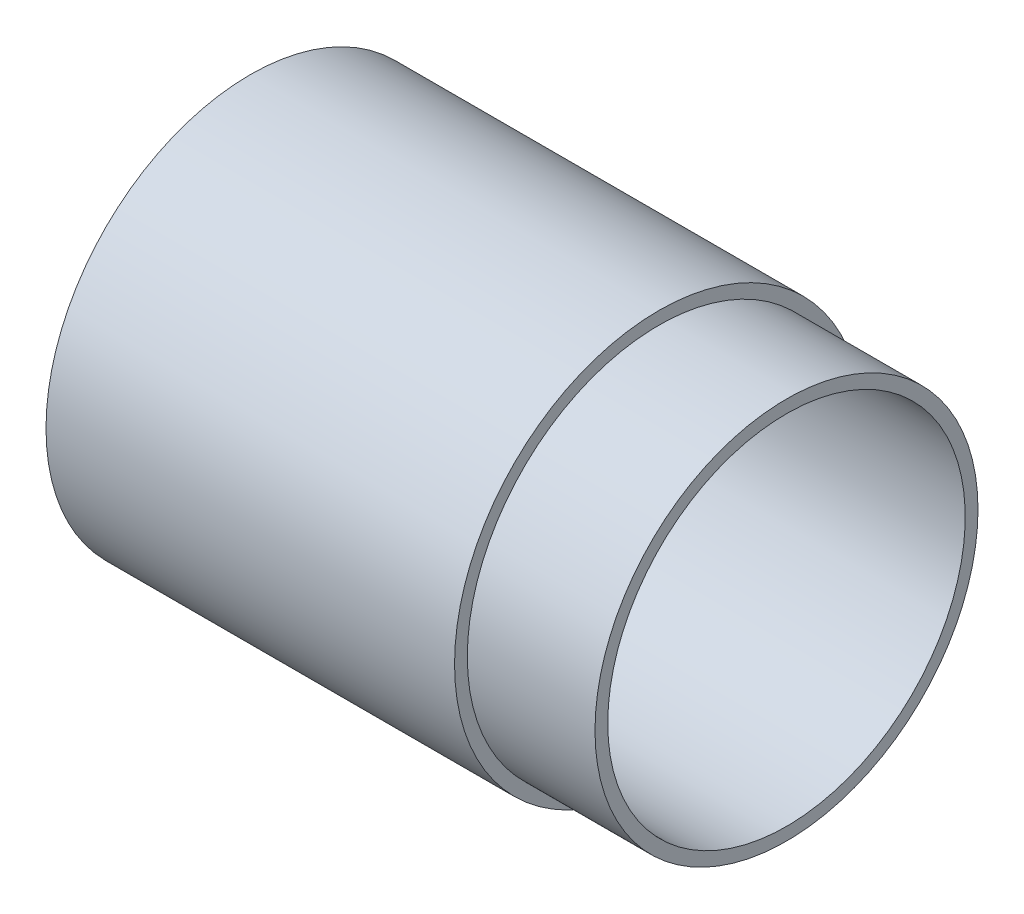
ISO-10303-21;
HEADER;
FILE_DESCRIPTION(('STEP AP214'),'2;1');
FILE_NAME('part.step','',(''),(''),'','','');
FILE_SCHEMA(('AUTOMOTIVE_DESIGN { 1 0 10303 214 1 1 1 1 }'));
ENDSEC;
DATA;
#1=APPLICATION_CONTEXT('core data for automotive mechanical design processes');
#2=APPLICATION_PROTOCOL_DEFINITION('international standard','automotive_design',2000,#1);
#3=PRODUCT_CONTEXT('',#1,'mechanical');
#4=PRODUCT('Part','Part','',(#3));
#5=PRODUCT_RELATED_PRODUCT_CATEGORY('part','',(#4));
#6=PRODUCT_DEFINITION_FORMATION('','',#4);
#7=PRODUCT_DEFINITION_CONTEXT('part definition',#1,'design');
#8=PRODUCT_DEFINITION('design','',#6,#7);
#9=PRODUCT_DEFINITION_SHAPE('','',#8);
#10=(LENGTH_UNIT() NAMED_UNIT(*) SI_UNIT(.MILLI.,.METRE.));
#11=(NAMED_UNIT(*) PLANE_ANGLE_UNIT() SI_UNIT($,.RADIAN.));
#12=(NAMED_UNIT(*) SI_UNIT($,.STERADIAN.) SOLID_ANGLE_UNIT());
#13=UNCERTAINTY_MEASURE_WITH_UNIT(LENGTH_MEASURE(1.E-05),#10,'distance_accuracy_value','');
#14=(GEOMETRIC_REPRESENTATION_CONTEXT(3) GLOBAL_UNCERTAINTY_ASSIGNED_CONTEXT((#13)) GLOBAL_UNIT_ASSIGNED_CONTEXT((#10,
#11,#12)) REPRESENTATION_CONTEXT('',''));
#15=CARTESIAN_POINT('',(0.,0.,0.));
#16=DIRECTION('',(0.,0.,1.));
#17=DIRECTION('',(1.,0.,0.));
#18=AXIS2_PLACEMENT_3D('',#15,#16,#17);
#19=CARTESIAN_POINT('',(210.,0.,0.));
#20=DIRECTION('',(1.,0.,0.));
#21=DIRECTION('',(0.,0.,-1.));
#22=AXIS2_PLACEMENT_3D('',#19,#20,#21);
#23=PLANE('',#22);
#24=CARTESIAN_POINT('',(210.,0.,0.));
#25=DIRECTION('',(-1.,0.,0.));
#26=DIRECTION('',(0.,0.,1.));
#27=AXIS2_PLACEMENT_3D('',#24,#25,#26);
#28=CIRCLE('',#27,70.);
#29=CARTESIAN_POINT('',(210.,0.,70.));
#30=VERTEX_POINT('',#29);
#31=EDGE_CURVE('E55',#30,#30,#28,.T.);
#32=ORIENTED_EDGE('',*,*,#31,.T.);
#33=EDGE_LOOP('',(#32));
#34=FACE_BOUND('',#33,.T.);
#35=CARTESIAN_POINT('',(210.,0.,0.));
#36=DIRECTION('',(-1.,0.,0.));
#37=DIRECTION('',(0.,0.,1.));
#38=AXIS2_PLACEMENT_3D('',#35,#36,#37);
#39=CIRCLE('',#38,75.);
#40=CARTESIAN_POINT('',(210.,0.,75.));
#41=VERTEX_POINT('',#40);
#42=EDGE_CURVE('E39',#41,#41,#39,.T.);
#43=ORIENTED_EDGE('',*,*,#42,.F.);
#44=EDGE_LOOP('',(#43));
#45=FACE_BOUND('',#44,.T.);
#46=ADVANCED_FACE('F31',(#34,#45),#23,.T.);
#47=CARTESIAN_POINT('',(0.,0.,0.));
#48=DIRECTION('',(-1.,0.,0.));
#49=DIRECTION('',(0.,0.,1.));
#50=AXIS2_PLACEMENT_3D('',#47,#48,#49);
#51=CYLINDRICAL_SURFACE('',#50,75.);
#52=CARTESIAN_POINT('',(160.,0.,0.));
#53=DIRECTION('',(1.,0.,0.));
#54=DIRECTION('',(0.,0.,-1.));
#55=AXIS2_PLACEMENT_3D('',#52,#53,#54);
#56=CIRCLE('',#55,75.);
#57=CARTESIAN_POINT('',(160.,0.,-75.));
#58=VERTEX_POINT('',#57);
#59=EDGE_CURVE('E10',#58,#58,#56,.F.);
#60=ORIENTED_EDGE('',*,*,#59,.F.);
#61=EDGE_LOOP('',(#60));
#62=FACE_BOUND('',#61,.T.);
#63=ORIENTED_EDGE('',*,*,#42,.T.);
#64=EDGE_LOOP('',(#63));
#65=FACE_BOUND('',#64,.T.);
#66=ADVANCED_FACE('F84',(#62,#65),#51,.T.);
#67=CARTESIAN_POINT('',(0.,0.,0.));
#68=DIRECTION('',(-1.,0.,0.));
#69=DIRECTION('',(0.,0.,1.));
#70=AXIS2_PLACEMENT_3D('',#67,#68,#69);
#71=CYLINDRICAL_SURFACE('',#70,70.);
#72=ORIENTED_EDGE('',*,*,#31,.F.);
#73=EDGE_LOOP('',(#72));
#74=FACE_BOUND('',#73,.T.);
#75=CARTESIAN_POINT('',(110.,0.,0.));
#76=DIRECTION('',(-1.,0.,0.));
#77=DIRECTION('',(0.,0.,1.));
#78=AXIS2_PLACEMENT_3D('',#75,#76,#77);
#79=CIRCLE('',#78,70.);
#80=CARTESIAN_POINT('',(110.,0.,70.));
#81=VERTEX_POINT('',#80);
#82=EDGE_CURVE('E59',#81,#81,#79,.T.);
#83=ORIENTED_EDGE('',*,*,#82,.T.);
#84=EDGE_LOOP('',(#83));
#85=FACE_BOUND('',#84,.T.);
#86=ADVANCED_FACE('F80',(#74,#85),#71,.F.);
#87=CARTESIAN_POINT('',(110.,0.,0.));
#88=DIRECTION('',(1.,0.,0.));
#89=DIRECTION('',(0.,0.,-1.));
#90=AXIS2_PLACEMENT_3D('',#87,#88,#89);
#91=PLANE('',#90);
#92=ORIENTED_EDGE('',*,*,#82,.F.);
#93=EDGE_LOOP('',(#92));
#94=FACE_BOUND('',#93,.T.);
#95=CARTESIAN_POINT('',(110.,0.,0.));
#96=DIRECTION('',(-1.,0.,0.));
#97=DIRECTION('',(0.,0.,1.));
#98=AXIS2_PLACEMENT_3D('',#95,#96,#97);
#99=CIRCLE('',#98,75.);
#100=CARTESIAN_POINT('',(110.,0.,75.));
#101=VERTEX_POINT('',#100);
#102=EDGE_CURVE('E44',#101,#101,#99,.T.);
#103=ORIENTED_EDGE('',*,*,#102,.T.);
#104=EDGE_LOOP('',(#103));
#105=FACE_BOUND('',#104,.T.);
#106=ADVANCED_FACE('F68',(#94,#105),#91,.F.);
#107=CARTESIAN_POINT('',(0.,0.,0.));
#108=DIRECTION('',(-1.,0.,0.));
#109=DIRECTION('',(0.,0.,1.));
#110=AXIS2_PLACEMENT_3D('',#107,#108,#109);
#111=CYLINDRICAL_SURFACE('',#110,80.);
#112=CARTESIAN_POINT('',(160.,0.,0.));
#113=DIRECTION('',(-1.,0.,0.));
#114=DIRECTION('',(0.,0.,1.));
#115=AXIS2_PLACEMENT_3D('',#112,#113,#114);
#116=CIRCLE('',#115,80.);
#117=CARTESIAN_POINT('',(160.,0.,80.));
#118=VERTEX_POINT('',#117);
#119=EDGE_CURVE('E50',#118,#118,#116,.T.);
#120=ORIENTED_EDGE('',*,*,#119,.T.);
#121=EDGE_LOOP('',(#120));
#122=FACE_BOUND('',#121,.T.);
#123=CARTESIAN_POINT('',(0.,0.,0.));
#124=DIRECTION('',(-1.,0.,0.));
#125=DIRECTION('',(0.,0.,1.));
#126=AXIS2_PLACEMENT_3D('',#123,#124,#125);
#127=CIRCLE('',#126,80.);
#128=CARTESIAN_POINT('',(0.,0.,80.));
#129=VERTEX_POINT('',#128);
#130=EDGE_CURVE('E48',#129,#129,#127,.T.);
#131=ORIENTED_EDGE('',*,*,#130,.F.);
#132=EDGE_LOOP('',(#131));
#133=FACE_BOUND('',#132,.T.);
#134=ADVANCED_FACE('F79',(#122,#133),#111,.T.);
#135=CARTESIAN_POINT('',(160.,80.,0.));
#136=DIRECTION('',(1.,0.,0.));
#137=DIRECTION('',(0.,0.,-1.));
#138=AXIS2_PLACEMENT_3D('',#135,#136,#137);
#139=PLANE('',#138);
#140=ORIENTED_EDGE('',*,*,#59,.T.);
#141=EDGE_LOOP('',(#140));
#142=FACE_BOUND('',#141,.T.);
#143=ORIENTED_EDGE('',*,*,#119,.F.);
#144=EDGE_LOOP('',(#143));
#145=FACE_BOUND('',#144,.T.);
#146=ADVANCED_FACE('F75',(#142,#145),#139,.T.);
#147=CARTESIAN_POINT('',(0.,80.,0.));
#148=DIRECTION('',(1.,0.,0.));
#149=DIRECTION('',(0.,0.,-1.));
#150=AXIS2_PLACEMENT_3D('',#147,#148,#149);
#151=PLANE('',#150);
#152=CARTESIAN_POINT('',(0.,0.,0.));
#153=DIRECTION('',(-1.,0.,0.));
#154=DIRECTION('',(0.,0.,1.));
#155=AXIS2_PLACEMENT_3D('',#152,#153,#154);
#156=CIRCLE('',#155,75.);
#157=CARTESIAN_POINT('',(0.,0.,75.));
#158=VERTEX_POINT('',#157);
#159=EDGE_CURVE('E35',#158,#158,#156,.T.);
#160=ORIENTED_EDGE('',*,*,#159,.F.);
#161=EDGE_LOOP('',(#160));
#162=FACE_BOUND('',#161,.T.);
#163=ORIENTED_EDGE('',*,*,#130,.T.);
#164=EDGE_LOOP('',(#163));
#165=FACE_BOUND('',#164,.T.);
#166=ADVANCED_FACE('F33',(#162,#165),#151,.F.);
#167=CARTESIAN_POINT('',(0.,0.,0.));
#168=DIRECTION('',(-1.,0.,0.));
#169=DIRECTION('',(0.,0.,1.));
#170=AXIS2_PLACEMENT_3D('',#167,#168,#169);
#171=CYLINDRICAL_SURFACE('',#170,75.);
#172=ORIENTED_EDGE('',*,*,#159,.T.);
#173=EDGE_LOOP('',(#172));
#174=FACE_BOUND('',#173,.T.);
#175=ORIENTED_EDGE('',*,*,#102,.F.);
#176=EDGE_LOOP('',(#175));
#177=FACE_BOUND('',#176,.T.);
#178=ADVANCED_FACE('F70',(#174,#177),#171,.F.);
#179=CLOSED_SHELL('',(#46,#66,#86,#106,#134,#146,#166,#178));
#180=MANIFOLD_SOLID_BREP('B2',#179);
#181=ADVANCED_BREP_SHAPE_REPRESENTATION('',(#18,#180),#14);
#182=SHAPE_DEFINITION_REPRESENTATION(#9,#181);
ENDSEC;
END-ISO-10303-21;
